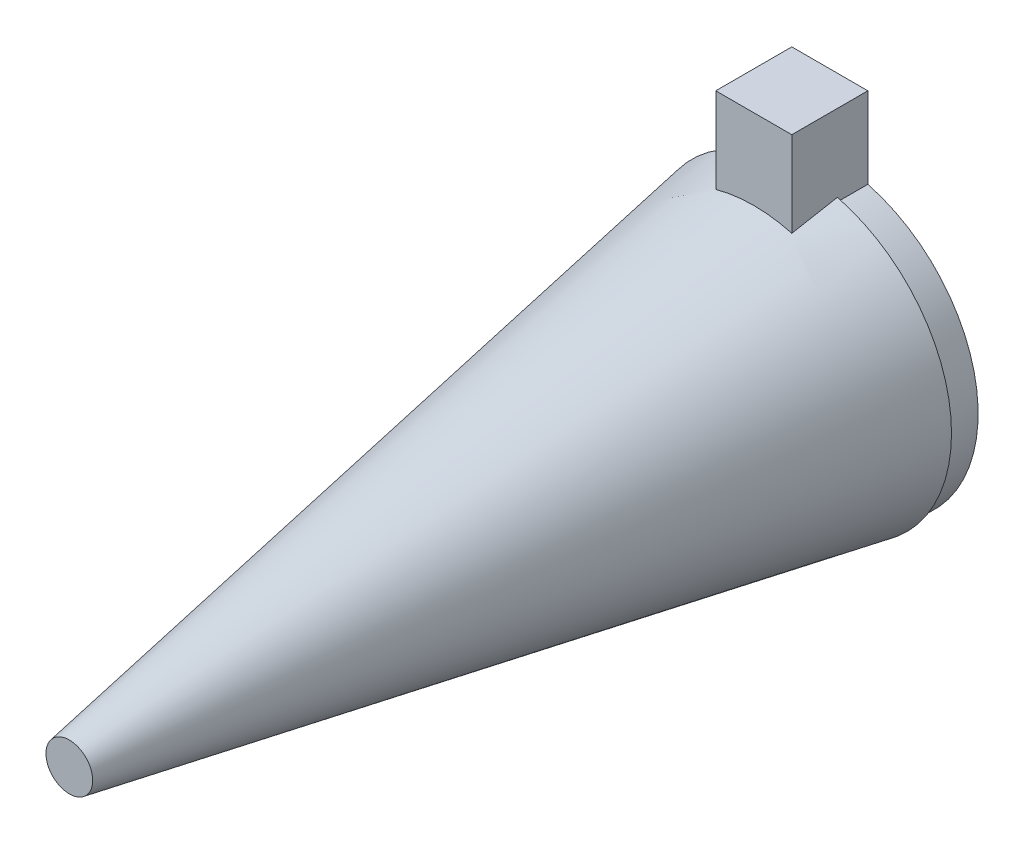
ISO-10303-21;
HEADER;
FILE_DESCRIPTION(('STEP AP214'),'2;1');
FILE_NAME('part.step','',(''),(''),'','','');
FILE_SCHEMA(('AUTOMOTIVE_DESIGN { 1 0 10303 214 1 1 1 1 }'));
ENDSEC;
DATA;
#1=APPLICATION_CONTEXT('core data for automotive mechanical design processes');
#2=APPLICATION_PROTOCOL_DEFINITION('international standard','automotive_design',2000,#1);
#3=PRODUCT_CONTEXT('',#1,'mechanical');
#4=PRODUCT('Part','Part','',(#3));
#5=PRODUCT_RELATED_PRODUCT_CATEGORY('part','',(#4));
#6=PRODUCT_DEFINITION_FORMATION('','',#4);
#7=PRODUCT_DEFINITION_CONTEXT('part definition',#1,'design');
#8=PRODUCT_DEFINITION('design','',#6,#7);
#9=PRODUCT_DEFINITION_SHAPE('','',#8);
#10=(LENGTH_UNIT() NAMED_UNIT(*) SI_UNIT(.MILLI.,.METRE.));
#11=(NAMED_UNIT(*) PLANE_ANGLE_UNIT() SI_UNIT($,.RADIAN.));
#12=(NAMED_UNIT(*) SI_UNIT($,.STERADIAN.) SOLID_ANGLE_UNIT());
#13=UNCERTAINTY_MEASURE_WITH_UNIT(LENGTH_MEASURE(1.E-05),#10,'distance_accuracy_value','');
#14=(GEOMETRIC_REPRESENTATION_CONTEXT(3) GLOBAL_UNCERTAINTY_ASSIGNED_CONTEXT((#13)) GLOBAL_UNIT_ASSIGNED_CONTEXT((#10,
#11,#12)) REPRESENTATION_CONTEXT('',''));
#15=CARTESIAN_POINT('',(0.,0.,0.));
#16=DIRECTION('',(0.,0.,1.));
#17=DIRECTION('',(1.,0.,0.));
#18=AXIS2_PLACEMENT_3D('',#15,#16,#17);
#19=CARTESIAN_POINT('',(4.2340624622228,-7.17949721855168,2.));
#20=DIRECTION('',(0.,0.,-1.));
#21=DIRECTION('',(-1.,0.,0.));
#22=AXIS2_PLACEMENT_3D('',#19,#20,#21);
#23=CYLINDRICAL_SURFACE('',#22,9.75);
#24=DIRECTION('',(0.,0.,-1.));
#25=VECTOR('',#24,1.);
#26=CARTESIAN_POINT('',(1.7340624622228,2.2445411939337,5.));
#27=LINE('',#26,#25);
#28=CARTESIAN_POINT('',(1.7340624622228,2.2445411939337,2.));
#29=VERTEX_POINT('',#28);
#30=CARTESIAN_POINT('',(1.7340624622228,2.2445411939337,0.));
#31=VERTEX_POINT('',#30);
#32=EDGE_CURVE('E146',#29,#31,#27,.T.);
#33=ORIENTED_EDGE('',*,*,#32,.T.);
#34=CARTESIAN_POINT('',(4.2340624622228,-7.17949721855168,0.));
#35=DIRECTION('',(0.,0.,1.));
#36=DIRECTION('',(1.,0.,0.));
#37=AXIS2_PLACEMENT_3D('',#34,#35,#36);
#38=CIRCLE('',#37,9.75);
#39=CARTESIAN_POINT('',(6.7340624622228,2.2445411939337,0.));
#40=VERTEX_POINT('',#39);
#41=EDGE_CURVE('E229',#31,#40,#38,.T.);
#42=ORIENTED_EDGE('',*,*,#41,.T.);
#43=DIRECTION('',(0.,0.,-1.));
#44=VECTOR('',#43,1.);
#45=CARTESIAN_POINT('',(6.7340624622228,2.2445411939337,5.));
#46=LINE('',#45,#44);
#47=CARTESIAN_POINT('',(6.7340624622228,2.2445411939337,2.));
#48=VERTEX_POINT('',#47);
#49=EDGE_CURVE('E115',#48,#40,#46,.T.);
#50=ORIENTED_EDGE('',*,*,#49,.F.);
#51=CARTESIAN_POINT('',(4.2340624622228,-7.17949721855168,2.));
#52=DIRECTION('',(0.,0.,1.));
#53=DIRECTION('',(1.,0.,0.));
#54=AXIS2_PLACEMENT_3D('',#51,#52,#53);
#55=CIRCLE('',#54,9.75);
#56=EDGE_CURVE('E230',#29,#48,#55,.T.);
#57=ORIENTED_EDGE('',*,*,#56,.F.);
#58=EDGE_LOOP('',(#33,#42,#50,#57));
#59=FACE_BOUND('',#58,.T.);
#60=ADVANCED_FACE('F47',(#59),#23,.T.);
#61=CARTESIAN_POINT('',(4.2340624622228,-7.17949721855168,2.));
#62=DIRECTION('',(0.,0.,1.));
#63=DIRECTION('',(1.,0.,0.));
#64=AXIS2_PLACEMENT_3D('',#61,#62,#63);
#65=PLANE('',#64);
#66=DIRECTION('',(0.,1.,0.));
#67=VECTOR('',#66,1.);
#68=CARTESIAN_POINT('',(1.7340624622228,-7.17949721855168,2.));
#69=LINE('',#68,#67);
#70=CARTESIAN_POINT('',(1.7340624622228,2.50296114696686,2.));
#71=VERTEX_POINT('',#70);
#72=EDGE_CURVE('E155',#29,#71,#69,.T.);
#73=ORIENTED_EDGE('',*,*,#72,.F.);
#74=ORIENTED_EDGE('',*,*,#56,.T.);
#75=DIRECTION('',(0.,1.,0.));
#76=VECTOR('',#75,1.);
#77=CARTESIAN_POINT('',(6.7340624622228,-7.17949721855168,2.));
#78=LINE('',#77,#76);
#79=CARTESIAN_POINT('',(6.7340624622228,2.50296114696686,2.));
#80=VERTEX_POINT('',#79);
#81=EDGE_CURVE('E145',#48,#80,#78,.T.);
#82=ORIENTED_EDGE('',*,*,#81,.T.);
#83=CARTESIAN_POINT('',(4.2340624622228,-7.17949721855168,2.));
#84=DIRECTION('',(0.,0.,1.));
#85=DIRECTION('',(1.,0.,0.));
#86=AXIS2_PLACEMENT_3D('',#83,#84,#85);
#87=CIRCLE('',#86,10.);
#88=EDGE_CURVE('E158',#71,#80,#87,.T.);
#89=ORIENTED_EDGE('',*,*,#88,.F.);
#90=EDGE_LOOP('',(#73,#74,#82,#89));
#91=FACE_BOUND('',#90,.T.);
#92=ADVANCED_FACE('F259',(#91),#65,.F.);
#93=CARTESIAN_POINT('',(4.2340624622228,-7.17949721855168,2.));
#94=DIRECTION('',(0.,0.,-1.));
#95=DIRECTION('',(1.,0.,0.));
#96=AXIS2_PLACEMENT_3D('',#93,#94,#95);
#97=CONICAL_SURFACE('',#96,10.,0.174532925199433);
#98=CARTESIAN_POINT('',(4.2340624622228,-7.17949721855168,50.));
#99=DIRECTION('',(0.,0.,1.));
#100=DIRECTION('',(1.,0.,0.));
#101=AXIS2_PLACEMENT_3D('',#98,#99,#100);
#102=CIRCLE('',#101,1.53630492599366);
#103=CARTESIAN_POINT('',(5.77036738821646,-7.17949721855168,50.));
#104=VERTEX_POINT('',#103);
#105=EDGE_CURVE('E161',#104,#104,#102,.T.);
#106=ORIENTED_EDGE('',*,*,#105,.F.);
#107=EDGE_LOOP('',(#106));
#108=FACE_BOUND('',#107,.T.);
#109=CARTESIAN_POINT('',(6.7340624622228,3.07786862837113,-1.16247766016838));
#110=CARTESIAN_POINT('',(6.7340624622228,3.07136590793536,-1.12664782565498));
#111=CARTESIAN_POINT('',(6.7340624622228,3.06486286526593,-1.09081804926034));
#112=CARTESIAN_POINT('',(6.7340624622228,2.50708707825692,1.98219735958766));
#113=CARTESIAN_POINT('',(6.7340624622228,1.95347946522304,5.01896170701057));
#114=CARTESIAN_POINT('',(6.7340624622228,1.38927836329357,8.0908182106466));
#115=CARTESIAN_POINT('',(6.7340624622228,1.38269700962104,8.12664798704144));
#116=CARTESIAN_POINT('',(6.7340624622228,1.37611509431505,8.16247766016838));
#117=B_SPLINE_CURVE_WITH_KNOTS('',3,(#109,#110,#111,#112,#113,#114,#115,#116),.UNSPECIFIED.,.F.,
.F.,(4,2,2,4),(0.,0.109245420772886,9.36967641395278,9.47896403370492),.UNSPECIFIED.);
#118=CARTESIAN_POINT('',(6.7340624622228,1.95561099069379,5.));
#119=VERTEX_POINT('',#118);
#120=EDGE_CURVE('E61',#80,#119,#117,.T.);
#121=ORIENTED_EDGE('',*,*,#120,.T.);
#122=CARTESIAN_POINT('',(4.2340624622228,-7.17949721855168,5.));
#123=DIRECTION('',(0.,0.,1.));
#124=DIRECTION('',(1.,0.,0.));
#125=AXIS2_PLACEMENT_3D('',#122,#123,#124);
#126=CIRCLE('',#125,9.4710190578746);
#127=CARTESIAN_POINT('',(1.7340624622228,1.95561099069378,5.));
#128=VERTEX_POINT('',#127);
#129=EDGE_CURVE('E129',#119,#128,#126,.T.);
#130=ORIENTED_EDGE('',*,*,#129,.T.);
#131=CARTESIAN_POINT('',(1.7340624622228,3.07786862837113,-1.16247766016838));
#132=CARTESIAN_POINT('',(1.7340624622228,3.07136590793536,-1.12664782565498));
#133=CARTESIAN_POINT('',(1.7340624622228,3.06486286526593,-1.09081804926034));
#134=CARTESIAN_POINT('',(1.7340624622228,2.50708707825692,1.98219735958766));
#135=CARTESIAN_POINT('',(1.7340624622228,1.95347946522264,5.0189617070105));
#136=CARTESIAN_POINT('',(1.7340624622228,1.38927836329357,8.0908182106466));
#137=CARTESIAN_POINT('',(1.7340624622228,1.38269700962104,8.12664798704144));
#138=CARTESIAN_POINT('',(1.7340624622228,1.37611509431506,8.16247766016838));
#139=B_SPLINE_CURVE_WITH_KNOTS('',3,(#131,#132,#133,#134,#135,#136,#137,#138),.UNSPECIFIED.,.F.,
.F.,(4,2,2,4),(0.,0.109245420772888,9.36967641395278,9.47896403370492),.UNSPECIFIED.);
#140=EDGE_CURVE('E11',#71,#128,#139,.T.);
#141=ORIENTED_EDGE('',*,*,#140,.F.);
#142=ORIENTED_EDGE('',*,*,#88,.T.);
#143=EDGE_LOOP('',(#121,#130,#141,#142));
#144=FACE_BOUND('',#143,.T.);
#145=ADVANCED_FACE('F242',(#108,#144),#97,.T.);
#146=CARTESIAN_POINT('',(4.2340624622228,-7.17949721855168,0.));
#147=DIRECTION('',(0.,0.,1.));
#148=DIRECTION('',(1.,0.,0.));
#149=AXIS2_PLACEMENT_3D('',#146,#147,#148);
#150=PLANE('',#149);
#151=DIRECTION('',(0.,-1.,0.));
#152=VECTOR('',#151,1.);
#153=CARTESIAN_POINT('',(6.7340624622228,0.,0.));
#154=LINE('',#153,#152);
#155=CARTESIAN_POINT('',(6.7340624622228,7.57050278144832,0.));
#156=VERTEX_POINT('',#155);
#157=EDGE_CURVE('E110',#156,#40,#154,.T.);
#158=ORIENTED_EDGE('',*,*,#157,.T.);
#159=ORIENTED_EDGE('',*,*,#41,.F.);
#160=DIRECTION('',(0.,-1.,0.));
#161=VECTOR('',#160,1.);
#162=CARTESIAN_POINT('',(1.7340624622228,0.,0.));
#163=LINE('',#162,#161);
#164=CARTESIAN_POINT('',(1.7340624622228,7.57050278144832,0.));
#165=VERTEX_POINT('',#164);
#166=EDGE_CURVE('E126',#165,#31,#163,.T.);
#167=ORIENTED_EDGE('',*,*,#166,.F.);
#168=DIRECTION('',(-1.,0.,0.));
#169=VECTOR('',#168,1.);
#170=CARTESIAN_POINT('',(0.,7.57050278144832,0.));
#171=LINE('',#170,#169);
#172=EDGE_CURVE('E136',#156,#165,#171,.T.);
#173=ORIENTED_EDGE('',*,*,#172,.F.);
#174=EDGE_LOOP('',(#158,#159,#167,#173));
#175=FACE_BOUND('',#174,.T.);
#176=CARTESIAN_POINT('',(4.2340624622228,0.270502781448316,0.));
#177=DIRECTION('',(0.,0.,1.));
#178=DIRECTION('',(1.,0.,0.));
#179=AXIS2_PLACEMENT_3D('',#176,#177,#178);
#180=CIRCLE('',#179,0.500000000000001);
#181=CARTESIAN_POINT('',(4.7340624622228,0.270502781448316,0.));
#182=VERTEX_POINT('',#181);
#183=EDGE_CURVE('E222',#182,#182,#180,.T.);
#184=ORIENTED_EDGE('',*,*,#183,.T.);
#185=EDGE_LOOP('',(#184));
#186=FACE_BOUND('',#185,.T.);
#187=CARTESIAN_POINT('',(4.23406246222266,-14.629497218552,0.));
#188=DIRECTION('',(0.,0.,1.));
#189=DIRECTION('',(1.,0.,0.));
#190=AXIS2_PLACEMENT_3D('',#187,#188,#189);
#191=CIRCLE('',#190,0.499999999999815);
#192=CARTESIAN_POINT('',(4.73406246222248,-14.629497218552,0.));
#193=VERTEX_POINT('',#192);
#194=EDGE_CURVE('E215',#193,#193,#191,.T.);
#195=ORIENTED_EDGE('',*,*,#194,.T.);
#196=EDGE_LOOP('',(#195));
#197=FACE_BOUND('',#196,.T.);
#198=CARTESIAN_POINT('',(9.50200798206268,-1.911551698712,0.));
#199=DIRECTION('',(0.,0.,1.));
#200=DIRECTION('',(1.,0.,0.));
#201=AXIS2_PLACEMENT_3D('',#198,#199,#200);
#202=CIRCLE('',#201,0.500000000000001);
#203=CARTESIAN_POINT('',(10.0020079820627,-1.911551698712,0.));
#204=VERTEX_POINT('',#203);
#205=EDGE_CURVE('E207',#204,#204,#202,.T.);
#206=ORIENTED_EDGE('',*,*,#205,.T.);
#207=EDGE_LOOP('',(#206));
#208=FACE_BOUND('',#207,.T.);
#209=CARTESIAN_POINT('',(11.6840624622228,-7.17949721855174,0.));
#210=DIRECTION('',(0.,0.,1.));
#211=DIRECTION('',(1.,0.,0.));
#212=AXIS2_PLACEMENT_3D('',#209,#210,#211);
#213=CIRCLE('',#212,0.500000000000001);
#214=CARTESIAN_POINT('',(12.1840624622228,-7.17949721855174,0.));
#215=VERTEX_POINT('',#214);
#216=EDGE_CURVE('E199',#215,#215,#213,.T.);
#217=ORIENTED_EDGE('',*,*,#216,.T.);
#218=EDGE_LOOP('',(#217));
#219=FACE_BOUND('',#218,.T.);
#220=CARTESIAN_POINT('',(9.50200798206258,-12.4474427383918,0.));
#221=DIRECTION('',(0.,0.,1.));
#222=DIRECTION('',(1.,0.,0.));
#223=AXIS2_PLACEMENT_3D('',#220,#221,#222);
#224=CIRCLE('',#223,0.499999999999734);
#225=CARTESIAN_POINT('',(10.0020079820623,-12.4474427383918,0.));
#226=VERTEX_POINT('',#225);
#227=EDGE_CURVE('E191',#226,#226,#224,.T.);
#228=ORIENTED_EDGE('',*,*,#227,.T.);
#229=EDGE_LOOP('',(#228));
#230=FACE_BOUND('',#229,.T.);
#231=CARTESIAN_POINT('',(-1.03388305761722,-12.4474427383917,0.));
#232=DIRECTION('',(0.,0.,1.));
#233=DIRECTION('',(1.,0.,0.));
#234=AXIS2_PLACEMENT_3D('',#231,#232,#233);
#235=CIRCLE('',#234,0.499999999999965);
#236=CARTESIAN_POINT('',(-0.533883057617257,-12.4474427383917,0.));
#237=VERTEX_POINT('',#236);
#238=EDGE_CURVE('E183',#237,#237,#235,.T.);
#239=ORIENTED_EDGE('',*,*,#238,.T.);
#240=EDGE_LOOP('',(#239));
#241=FACE_BOUND('',#240,.T.);
#242=CARTESIAN_POINT('',(-3.21593753777745,-7.17949721855179,0.));
#243=DIRECTION('',(0.,0.,1.));
#244=DIRECTION('',(1.,0.,0.));
#245=AXIS2_PLACEMENT_3D('',#242,#243,#244);
#246=CIRCLE('',#245,0.500000000000104);
#247=CARTESIAN_POINT('',(-2.71593753777734,-7.17949721855179,0.));
#248=VERTEX_POINT('',#247);
#249=EDGE_CURVE('E174',#248,#248,#246,.T.);
#250=ORIENTED_EDGE('',*,*,#249,.T.);
#251=EDGE_LOOP('',(#250));
#252=FACE_BOUND('',#251,.T.);
#253=CARTESIAN_POINT('',(-1.03388305761692,-1.91155169871184,0.));
#254=DIRECTION('',(0.,0.,1.));
#255=DIRECTION('',(1.,0.,0.));
#256=AXIS2_PLACEMENT_3D('',#253,#254,#255);
#257=CIRCLE('',#256,0.5);
#258=CARTESIAN_POINT('',(-0.533883057616918,-1.91155169871184,0.));
#259=VERTEX_POINT('',#258);
#260=EDGE_CURVE('E170',#259,#259,#257,.T.);
#261=ORIENTED_EDGE('',*,*,#260,.T.);
#262=EDGE_LOOP('',(#261));
#263=FACE_BOUND('',#262,.T.);
#264=ADVANCED_FACE('F268',(#175,#186,#197,#208,#219,#230,#241,#252,#263),#150,.F.);
#265=CARTESIAN_POINT('',(4.2340624622228,0.270502781448316,2.));
#266=DIRECTION('',(0.,0.,-1.));
#267=DIRECTION('',(-1.,0.,0.));
#268=AXIS2_PLACEMENT_3D('',#265,#266,#267);
#269=CYLINDRICAL_SURFACE('',#268,0.500000000000001);
#270=CARTESIAN_POINT('',(4.2340624622228,0.270502781448316,2.));
#271=DIRECTION('',(0.,0.,1.));
#272=DIRECTION('',(1.,0.,0.));
#273=AXIS2_PLACEMENT_3D('',#270,#271,#272);
#274=CIRCLE('',#273,0.500000000000001);
#275=CARTESIAN_POINT('',(4.7340624622228,0.270502781448316,2.));
#276=VERTEX_POINT('',#275);
#277=EDGE_CURVE('E211',#276,#276,#274,.T.);
#278=ORIENTED_EDGE('',*,*,#277,.T.);
#279=EDGE_LOOP('',(#278));
#280=FACE_BOUND('',#279,.T.);
#281=ORIENTED_EDGE('',*,*,#183,.F.);
#282=EDGE_LOOP('',(#281));
#283=FACE_BOUND('',#282,.T.);
#284=ADVANCED_FACE('F292',(#280,#283),#269,.F.);
#285=CARTESIAN_POINT('',(4.23406246222266,-14.629497218552,2.));
#286=DIRECTION('',(0.,0.,-1.));
#287=DIRECTION('',(-1.,0.,0.));
#288=AXIS2_PLACEMENT_3D('',#285,#286,#287);
#289=CYLINDRICAL_SURFACE('',#288,0.499999999999815);
#290=CARTESIAN_POINT('',(4.23406246222266,-14.629497218552,2.));
#291=DIRECTION('',(0.,0.,1.));
#292=DIRECTION('',(1.,0.,0.));
#293=AXIS2_PLACEMENT_3D('',#290,#291,#292);
#294=CIRCLE('',#293,0.499999999999815);
#295=CARTESIAN_POINT('',(4.73406246222248,-14.629497218552,2.));
#296=VERTEX_POINT('',#295);
#297=EDGE_CURVE('E203',#296,#296,#294,.T.);
#298=ORIENTED_EDGE('',*,*,#297,.T.);
#299=EDGE_LOOP('',(#298));
#300=FACE_BOUND('',#299,.T.);
#301=ORIENTED_EDGE('',*,*,#194,.F.);
#302=EDGE_LOOP('',(#301));
#303=FACE_BOUND('',#302,.T.);
#304=ADVANCED_FACE('F298',(#300,#303),#289,.F.);
#305=CARTESIAN_POINT('',(9.50200798206268,-1.911551698712,2.));
#306=DIRECTION('',(0.,0.,-1.));
#307=DIRECTION('',(-1.,0.,0.));
#308=AXIS2_PLACEMENT_3D('',#305,#306,#307);
#309=CYLINDRICAL_SURFACE('',#308,0.500000000000001);
#310=CARTESIAN_POINT('',(9.50200798206268,-1.911551698712,2.));
#311=DIRECTION('',(0.,0.,1.));
#312=DIRECTION('',(1.,0.,0.));
#313=AXIS2_PLACEMENT_3D('',#310,#311,#312);
#314=CIRCLE('',#313,0.500000000000001);
#315=CARTESIAN_POINT('',(10.0020079820627,-1.911551698712,2.));
#316=VERTEX_POINT('',#315);
#317=EDGE_CURVE('E195',#316,#316,#314,.T.);
#318=ORIENTED_EDGE('',*,*,#317,.T.);
#319=EDGE_LOOP('',(#318));
#320=FACE_BOUND('',#319,.T.);
#321=ORIENTED_EDGE('',*,*,#205,.F.);
#322=EDGE_LOOP('',(#321));
#323=FACE_BOUND('',#322,.T.);
#324=ADVANCED_FACE('F305',(#320,#323),#309,.F.);
#325=CARTESIAN_POINT('',(11.6840624622228,-7.17949721855174,2.));
#326=DIRECTION('',(0.,0.,-1.));
#327=DIRECTION('',(-1.,0.,0.));
#328=AXIS2_PLACEMENT_3D('',#325,#326,#327);
#329=CYLINDRICAL_SURFACE('',#328,0.500000000000001);
#330=CARTESIAN_POINT('',(11.6840624622228,-7.17949721855174,2.));
#331=DIRECTION('',(0.,0.,1.));
#332=DIRECTION('',(1.,0.,0.));
#333=AXIS2_PLACEMENT_3D('',#330,#331,#332);
#334=CIRCLE('',#333,0.500000000000001);
#335=CARTESIAN_POINT('',(12.1840624622228,-7.17949721855174,2.));
#336=VERTEX_POINT('',#335);
#337=EDGE_CURVE('E187',#336,#336,#334,.T.);
#338=ORIENTED_EDGE('',*,*,#337,.T.);
#339=EDGE_LOOP('',(#338));
#340=FACE_BOUND('',#339,.T.);
#341=ORIENTED_EDGE('',*,*,#216,.F.);
#342=EDGE_LOOP('',(#341));
#343=FACE_BOUND('',#342,.T.);
#344=ADVANCED_FACE('F309',(#340,#343),#329,.F.);
#345=CARTESIAN_POINT('',(9.50200798206258,-12.4474427383918,2.));
#346=DIRECTION('',(0.,0.,-1.));
#347=DIRECTION('',(-1.,0.,0.));
#348=AXIS2_PLACEMENT_3D('',#345,#346,#347);
#349=CYLINDRICAL_SURFACE('',#348,0.499999999999734);
#350=CARTESIAN_POINT('',(9.50200798206258,-12.4474427383918,2.));
#351=DIRECTION('',(0.,0.,1.));
#352=DIRECTION('',(1.,0.,0.));
#353=AXIS2_PLACEMENT_3D('',#350,#351,#352);
#354=CIRCLE('',#353,0.499999999999734);
#355=CARTESIAN_POINT('',(10.0020079820623,-12.4474427383918,2.));
#356=VERTEX_POINT('',#355);
#357=EDGE_CURVE('E179',#356,#356,#354,.T.);
#358=ORIENTED_EDGE('',*,*,#357,.T.);
#359=EDGE_LOOP('',(#358));
#360=FACE_BOUND('',#359,.T.);
#361=ORIENTED_EDGE('',*,*,#227,.F.);
#362=EDGE_LOOP('',(#361));
#363=FACE_BOUND('',#362,.T.);
#364=ADVANCED_FACE('F313',(#360,#363),#349,.F.);
#365=CARTESIAN_POINT('',(-1.03388305761722,-12.4474427383917,2.));
#366=DIRECTION('',(0.,0.,-1.));
#367=DIRECTION('',(-1.,0.,0.));
#368=AXIS2_PLACEMENT_3D('',#365,#366,#367);
#369=CYLINDRICAL_SURFACE('',#368,0.499999999999965);
#370=CARTESIAN_POINT('',(-1.03388305761722,-12.4474427383917,2.));
#371=DIRECTION('',(0.,0.,1.));
#372=DIRECTION('',(1.,0.,0.));
#373=AXIS2_PLACEMENT_3D('',#370,#371,#372);
#374=CIRCLE('',#373,0.499999999999965);
#375=CARTESIAN_POINT('',(-0.533883057617257,-12.4474427383917,2.));
#376=VERTEX_POINT('',#375);
#377=EDGE_CURVE('E169',#376,#376,#374,.T.);
#378=ORIENTED_EDGE('',*,*,#377,.T.);
#379=EDGE_LOOP('',(#378));
#380=FACE_BOUND('',#379,.T.);
#381=ORIENTED_EDGE('',*,*,#238,.F.);
#382=EDGE_LOOP('',(#381));
#383=FACE_BOUND('',#382,.T.);
#384=ADVANCED_FACE('F317',(#380,#383),#369,.F.);
#385=CARTESIAN_POINT('',(-3.21593753777745,-7.17949721855179,2.));
#386=DIRECTION('',(0.,0.,-1.));
#387=DIRECTION('',(-1.,0.,0.));
#388=AXIS2_PLACEMENT_3D('',#385,#386,#387);
#389=CYLINDRICAL_SURFACE('',#388,0.500000000000104);
#390=CARTESIAN_POINT('',(-3.21593753777745,-7.17949721855179,2.));
#391=DIRECTION('',(0.,0.,1.));
#392=DIRECTION('',(1.,0.,0.));
#393=AXIS2_PLACEMENT_3D('',#390,#391,#392);
#394=CIRCLE('',#393,0.500000000000104);
#395=CARTESIAN_POINT('',(-2.71593753777734,-7.17949721855179,2.));
#396=VERTEX_POINT('',#395);
#397=EDGE_CURVE('E175',#396,#396,#394,.T.);
#398=ORIENTED_EDGE('',*,*,#397,.T.);
#399=EDGE_LOOP('',(#398));
#400=FACE_BOUND('',#399,.T.);
#401=ORIENTED_EDGE('',*,*,#249,.F.);
#402=EDGE_LOOP('',(#401));
#403=FACE_BOUND('',#402,.T.);
#404=ADVANCED_FACE('F285',(#400,#403),#389,.F.);
#405=CARTESIAN_POINT('',(-1.03388305761692,-1.91155169871184,2.));
#406=DIRECTION('',(0.,0.,-1.));
#407=DIRECTION('',(-1.,0.,0.));
#408=AXIS2_PLACEMENT_3D('',#405,#406,#407);
#409=CYLINDRICAL_SURFACE('',#408,0.5);
#410=CARTESIAN_POINT('',(-1.03388305761692,-1.91155169871184,2.));
#411=DIRECTION('',(0.,0.,1.));
#412=DIRECTION('',(1.,0.,0.));
#413=AXIS2_PLACEMENT_3D('',#410,#411,#412);
#414=CIRCLE('',#413,0.5);
#415=CARTESIAN_POINT('',(-0.533883057616918,-1.91155169871184,2.));
#416=VERTEX_POINT('',#415);
#417=EDGE_CURVE('E165',#416,#416,#414,.T.);
#418=ORIENTED_EDGE('',*,*,#417,.T.);
#419=EDGE_LOOP('',(#418));
#420=FACE_BOUND('',#419,.T.);
#421=ORIENTED_EDGE('',*,*,#260,.F.);
#422=EDGE_LOOP('',(#421));
#423=FACE_BOUND('',#422,.T.);
#424=ADVANCED_FACE('F277',(#420,#423),#409,.F.);
#425=ORIENTED_EDGE('',*,*,#417,.F.);
#426=EDGE_LOOP('',(#425));
#427=FACE_BOUND('',#426,.T.);
#428=ADVANCED_FACE('F263',(#427),#65,.F.);
#429=ORIENTED_EDGE('',*,*,#377,.F.);
#430=EDGE_LOOP('',(#429));
#431=FACE_BOUND('',#430,.T.);
#432=ADVANCED_FACE('F276',(#431),#65,.F.);
#433=ORIENTED_EDGE('',*,*,#337,.F.);
#434=EDGE_LOOP('',(#433));
#435=FACE_BOUND('',#434,.T.);
#436=ADVANCED_FACE('F283',(#435),#65,.F.);
#437=ORIENTED_EDGE('',*,*,#297,.F.);
#438=EDGE_LOOP('',(#437));
#439=FACE_BOUND('',#438,.T.);
#440=ADVANCED_FACE('F257',(#439),#65,.F.);
#441=CARTESIAN_POINT('',(4.2340624622228,-7.17949721855168,50.));
#442=DIRECTION('',(0.,0.,1.));
#443=DIRECTION('',(1.,0.,0.));
#444=AXIS2_PLACEMENT_3D('',#441,#442,#443);
#445=PLANE('',#444);
#446=ORIENTED_EDGE('',*,*,#105,.T.);
#447=EDGE_LOOP('',(#446));
#448=FACE_BOUND('',#447,.T.);
#449=ADVANCED_FACE('F254',(#448),#445,.T.);
#450=ORIENTED_EDGE('',*,*,#277,.F.);
#451=EDGE_LOOP('',(#450));
#452=FACE_BOUND('',#451,.T.);
#453=ADVANCED_FACE('F256',(#452),#65,.F.);
#454=ORIENTED_EDGE('',*,*,#317,.F.);
#455=EDGE_LOOP('',(#454));
#456=FACE_BOUND('',#455,.T.);
#457=ADVANCED_FACE('F379',(#456),#65,.F.);
#458=ORIENTED_EDGE('',*,*,#357,.F.);
#459=EDGE_LOOP('',(#458));
#460=FACE_BOUND('',#459,.T.);
#461=ADVANCED_FACE('F273',(#460),#65,.F.);
#462=ORIENTED_EDGE('',*,*,#397,.F.);
#463=EDGE_LOOP('',(#462));
#464=FACE_BOUND('',#463,.T.);
#465=ADVANCED_FACE('F262',(#464),#65,.F.);
#466=CARTESIAN_POINT('',(1.7340624622228,0.,5.));
#467=DIRECTION('',(1.,0.,0.));
#468=DIRECTION('',(0.,0.,-1.));
#469=AXIS2_PLACEMENT_3D('',#466,#467,#468);
#470=PLANE('',#469);
#471=ORIENTED_EDGE('',*,*,#32,.F.);
#472=ORIENTED_EDGE('',*,*,#72,.T.);
#473=ORIENTED_EDGE('',*,*,#140,.T.);
#474=DIRECTION('',(0.,-1.,0.));
#475=VECTOR('',#474,1.);
#476=CARTESIAN_POINT('',(1.7340624622228,0.,5.));
#477=LINE('',#476,#475);
#478=CARTESIAN_POINT('',(1.7340624622228,7.57050278144832,5.));
#479=VERTEX_POINT('',#478);
#480=EDGE_CURVE('E116',#479,#128,#477,.T.);
#481=ORIENTED_EDGE('',*,*,#480,.F.);
#482=DIRECTION('',(0.,0.,-1.));
#483=VECTOR('',#482,1.);
#484=CARTESIAN_POINT('',(1.7340624622228,7.57050278144832,5.));
#485=LINE('',#484,#483);
#486=EDGE_CURVE('E123',#479,#165,#485,.T.);
#487=ORIENTED_EDGE('',*,*,#486,.T.);
#488=ORIENTED_EDGE('',*,*,#166,.T.);
#489=EDGE_LOOP('',(#471,#472,#473,#481,#487,#488));
#490=FACE_BOUND('',#489,.T.);
#491=ADVANCED_FACE('F249',(#490),#470,.F.);
#492=CARTESIAN_POINT('',(6.7340624622228,0.,5.));
#493=DIRECTION('',(1.,0.,0.));
#494=DIRECTION('',(0.,0.,-1.));
#495=AXIS2_PLACEMENT_3D('',#492,#493,#494);
#496=PLANE('',#495);
#497=ORIENTED_EDGE('',*,*,#81,.F.);
#498=ORIENTED_EDGE('',*,*,#49,.T.);
#499=ORIENTED_EDGE('',*,*,#157,.F.);
#500=DIRECTION('',(0.,0.,-1.));
#501=VECTOR('',#500,1.);
#502=CARTESIAN_POINT('',(6.7340624622228,7.57050278144832,5.));
#503=LINE('',#502,#501);
#504=CARTESIAN_POINT('',(6.7340624622228,7.57050278144832,5.));
#505=VERTEX_POINT('',#504);
#506=EDGE_CURVE('E103',#505,#156,#503,.T.);
#507=ORIENTED_EDGE('',*,*,#506,.F.);
#508=DIRECTION('',(0.,-1.,0.));
#509=VECTOR('',#508,1.);
#510=CARTESIAN_POINT('',(6.7340624622228,0.,5.));
#511=LINE('',#510,#509);
#512=EDGE_CURVE('E107',#505,#119,#511,.T.);
#513=ORIENTED_EDGE('',*,*,#512,.T.);
#514=ORIENTED_EDGE('',*,*,#120,.F.);
#515=EDGE_LOOP('',(#497,#498,#499,#507,#513,#514));
#516=FACE_BOUND('',#515,.T.);
#517=ADVANCED_FACE('F105',(#516),#496,.T.);
#518=CARTESIAN_POINT('',(0.,7.57050278144832,5.));
#519=DIRECTION('',(0.,-1.,0.));
#520=DIRECTION('',(0.,0.,-1.));
#521=AXIS2_PLACEMENT_3D('',#518,#519,#520);
#522=PLANE('',#521);
#523=ORIENTED_EDGE('',*,*,#172,.T.);
#524=ORIENTED_EDGE('',*,*,#486,.F.);
#525=DIRECTION('',(-1.,0.,0.));
#526=VECTOR('',#525,1.);
#527=CARTESIAN_POINT('',(0.,7.57050278144832,5.));
#528=LINE('',#527,#526);
#529=EDGE_CURVE('E120',#505,#479,#528,.T.);
#530=ORIENTED_EDGE('',*,*,#529,.F.);
#531=ORIENTED_EDGE('',*,*,#506,.T.);
#532=EDGE_LOOP('',(#523,#524,#530,#531));
#533=FACE_BOUND('',#532,.T.);
#534=ADVANCED_FACE('F121',(#533),#522,.F.);
#535=CARTESIAN_POINT('',(0.,0.,5.));
#536=DIRECTION('',(0.,0.,-1.));
#537=DIRECTION('',(-1.,0.,0.));
#538=AXIS2_PLACEMENT_3D('',#535,#536,#537);
#539=PLANE('',#538);
#540=ORIENTED_EDGE('',*,*,#529,.T.);
#541=ORIENTED_EDGE('',*,*,#480,.T.);
#542=ORIENTED_EDGE('',*,*,#129,.F.);
#543=ORIENTED_EDGE('',*,*,#512,.F.);
#544=EDGE_LOOP('',(#540,#541,#542,#543));
#545=FACE_BOUND('',#544,.T.);
#546=ADVANCED_FACE('F128',(#545),#539,.F.);
#547=CLOSED_SHELL('',(#60,#92,#145,#264,#284,#304,#324,#344,#364,#384,#404,#424,#428,#432,#436,
#440,#449,#453,#457,#461,#465,#491,#517,#534,#546));
#548=MANIFOLD_SOLID_BREP('B2',#547);
#549=ADVANCED_BREP_SHAPE_REPRESENTATION('',(#18,#548),#14);
#550=SHAPE_DEFINITION_REPRESENTATION(#9,#549);
ENDSEC;
END-ISO-10303-21;
